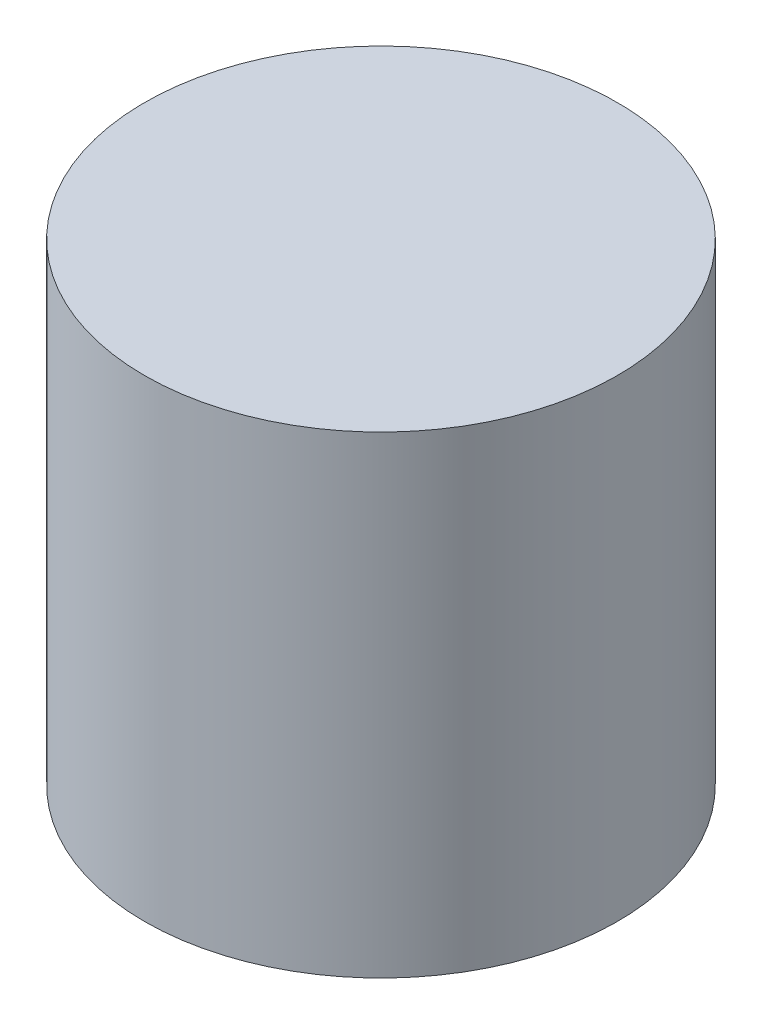
ISO-10303-21;
HEADER;
FILE_DESCRIPTION(('STEP AP214'),'2;1');
FILE_NAME('part.step','',(''),(''),'','','');
FILE_SCHEMA(('AUTOMOTIVE_DESIGN { 1 0 10303 214 1 1 1 1 }'));
ENDSEC;
DATA;
#1=APPLICATION_CONTEXT('core data for automotive mechanical design processes');
#2=APPLICATION_PROTOCOL_DEFINITION('international standard','automotive_design',2000,#1);
#3=PRODUCT_CONTEXT('',#1,'mechanical');
#4=PRODUCT('Part','Part','',(#3));
#5=PRODUCT_RELATED_PRODUCT_CATEGORY('part','',(#4));
#6=PRODUCT_DEFINITION_FORMATION('','',#4);
#7=PRODUCT_DEFINITION_CONTEXT('part definition',#1,'design');
#8=PRODUCT_DEFINITION('design','',#6,#7);
#9=PRODUCT_DEFINITION_SHAPE('','',#8);
#10=(LENGTH_UNIT() NAMED_UNIT(*) SI_UNIT(.MILLI.,.METRE.));
#11=(NAMED_UNIT(*) PLANE_ANGLE_UNIT() SI_UNIT($,.RADIAN.));
#12=(NAMED_UNIT(*) SI_UNIT($,.STERADIAN.) SOLID_ANGLE_UNIT());
#13=UNCERTAINTY_MEASURE_WITH_UNIT(LENGTH_MEASURE(1.E-05),#10,'distance_accuracy_value','');
#14=(GEOMETRIC_REPRESENTATION_CONTEXT(3) GLOBAL_UNCERTAINTY_ASSIGNED_CONTEXT((#13)) GLOBAL_UNIT_ASSIGNED_CONTEXT((#10,
#11,#12)) REPRESENTATION_CONTEXT('',''));
#15=CARTESIAN_POINT('',(0.,0.,0.));
#16=DIRECTION('',(0.,0.,1.));
#17=DIRECTION('',(1.,0.,0.));
#18=AXIS2_PLACEMENT_3D('',#15,#16,#17);
#19=CARTESIAN_POINT('',(0.,0.,0.));
#20=DIRECTION('',(0.,1.,0.));
#21=DIRECTION('',(0.,0.,1.));
#22=AXIS2_PLACEMENT_3D('',#19,#20,#21);
#23=PLANE('',#22);
#24=CARTESIAN_POINT('',(-1.984375,0.,0.));
#25=DIRECTION('',(0.,-1.,0.));
#26=DIRECTION('',(0.,0.,-1.));
#27=AXIS2_PLACEMENT_3D('',#24,#25,#26);
#28=CIRCLE('',#27,0.396875);
#29=CARTESIAN_POINT('',(-1.984375,0.,-0.396875));
#30=VERTEX_POINT('',#29);
#31=EDGE_CURVE('E53',#30,#30,#28,.T.);
#32=ORIENTED_EDGE('',*,*,#31,.F.);
#33=EDGE_LOOP('',(#32));
#34=FACE_BOUND('',#33,.T.);
#35=CARTESIAN_POINT('',(0.,0.,0.));
#36=DIRECTION('',(0.,1.,0.));
#37=DIRECTION('',(0.,0.,1.));
#38=AXIS2_PLACEMENT_3D('',#35,#36,#37);
#39=CIRCLE('',#38,3.175);
#40=CARTESIAN_POINT('',(0.,0.,3.175));
#41=VERTEX_POINT('',#40);
#42=EDGE_CURVE('E41',#41,#41,#39,.T.);
#43=ORIENTED_EDGE('',*,*,#42,.F.);
#44=EDGE_LOOP('',(#43));
#45=FACE_BOUND('',#44,.T.);
#46=CARTESIAN_POINT('',(1.984375,0.,0.));
#47=DIRECTION('',(0.,-1.,0.));
#48=DIRECTION('',(0.,0.,-1.));
#49=AXIS2_PLACEMENT_3D('',#46,#47,#48);
#50=CIRCLE('',#49,0.396875000000001);
#51=CARTESIAN_POINT('',(1.984375,0.,-0.396875000000001));
#52=VERTEX_POINT('',#51);
#53=EDGE_CURVE('E56',#52,#52,#50,.F.);
#54=ORIENTED_EDGE('',*,*,#53,.T.);
#55=EDGE_LOOP('',(#54));
#56=FACE_BOUND('',#55,.T.);
#57=ADVANCED_FACE('F37',(#34,#45,#56),#23,.F.);
#58=CARTESIAN_POINT('',(0.,6.35,0.));
#59=DIRECTION('',(0.,-1.,0.));
#60=DIRECTION('',(0.,0.,-1.));
#61=AXIS2_PLACEMENT_3D('',#58,#59,#60);
#62=CYLINDRICAL_SURFACE('',#61,3.175);
#63=CARTESIAN_POINT('',(0.,6.35,0.));
#64=DIRECTION('',(0.,1.,0.));
#65=DIRECTION('',(0.,0.,1.));
#66=AXIS2_PLACEMENT_3D('',#63,#64,#65);
#67=CIRCLE('',#66,3.175);
#68=CARTESIAN_POINT('',(0.,6.35,3.175));
#69=VERTEX_POINT('',#68);
#70=EDGE_CURVE('E10',#69,#69,#67,.T.);
#71=ORIENTED_EDGE('',*,*,#70,.F.);
#72=EDGE_LOOP('',(#71));
#73=FACE_BOUND('',#72,.T.);
#74=ORIENTED_EDGE('',*,*,#42,.T.);
#75=EDGE_LOOP('',(#74));
#76=FACE_BOUND('',#75,.T.);
#77=ADVANCED_FACE('F39',(#73,#76),#62,.T.);
#78=CARTESIAN_POINT('',(0.,6.35,0.));
#79=DIRECTION('',(0.,1.,0.));
#80=DIRECTION('',(0.,0.,1.));
#81=AXIS2_PLACEMENT_3D('',#78,#79,#80);
#82=PLANE('',#81);
#83=ORIENTED_EDGE('',*,*,#70,.T.);
#84=EDGE_LOOP('',(#83));
#85=FACE_BOUND('',#84,.T.);
#86=ADVANCED_FACE('F80',(#85),#82,.T.);
#87=CARTESIAN_POINT('',(-1.984375,2.11666666666667,0.));
#88=DIRECTION('',(0.,-1.,0.));
#89=DIRECTION('',(0.,0.,-1.));
#90=AXIS2_PLACEMENT_3D('',#87,#88,#89);
#91=CYLINDRICAL_SURFACE('',#90,0.396875);
#92=CARTESIAN_POINT('',(-1.984375,2.11666666666667,0.));
#93=DIRECTION('',(0.,-1.,0.));
#94=DIRECTION('',(0.,0.,-1.));
#95=AXIS2_PLACEMENT_3D('',#92,#93,#94);
#96=CIRCLE('',#95,0.396875);
#97=CARTESIAN_POINT('',(-1.984375,2.11666666666667,-0.396875));
#98=VERTEX_POINT('',#97);
#99=EDGE_CURVE('E50',#98,#98,#96,.T.);
#100=ORIENTED_EDGE('',*,*,#99,.F.);
#101=EDGE_LOOP('',(#100));
#102=FACE_BOUND('',#101,.T.);
#103=ORIENTED_EDGE('',*,*,#31,.T.);
#104=EDGE_LOOP('',(#103));
#105=FACE_BOUND('',#104,.T.);
#106=ADVANCED_FACE('F86',(#102,#105),#91,.F.);
#107=CARTESIAN_POINT('',(-1.984375,2.11666666666667,0.));
#108=DIRECTION('',(0.,-1.,0.));
#109=DIRECTION('',(0.,0.,-1.));
#110=AXIS2_PLACEMENT_3D('',#107,#108,#109);
#111=PLANE('',#110);
#112=ORIENTED_EDGE('',*,*,#99,.T.);
#113=EDGE_LOOP('',(#112));
#114=FACE_BOUND('',#113,.T.);
#115=ADVANCED_FACE('F71',(#114),#111,.T.);
#116=CARTESIAN_POINT('',(1.984375,2.11666666666667,0.));
#117=DIRECTION('',(0.,-1.,0.));
#118=DIRECTION('',(0.,0.,-1.));
#119=AXIS2_PLACEMENT_3D('',#116,#117,#118);
#120=CYLINDRICAL_SURFACE('',#119,0.396875000000001);
#121=CARTESIAN_POINT('',(1.984375,2.11666666666667,0.));
#122=DIRECTION('',(0.,-1.,0.));
#123=DIRECTION('',(0.,0.,-1.));
#124=AXIS2_PLACEMENT_3D('',#121,#122,#123);
#125=CIRCLE('',#124,0.396875000000001);
#126=CARTESIAN_POINT('',(1.984375,2.11666666666667,-0.396875000000001));
#127=VERTEX_POINT('',#126);
#128=EDGE_CURVE('E48',#127,#127,#125,.F.);
#129=ORIENTED_EDGE('',*,*,#128,.T.);
#130=EDGE_LOOP('',(#129));
#131=FACE_BOUND('',#130,.T.);
#132=ORIENTED_EDGE('',*,*,#53,.F.);
#133=EDGE_LOOP('',(#132));
#134=FACE_BOUND('',#133,.T.);
#135=ADVANCED_FACE('F62',(#131,#134),#120,.F.);
#136=CARTESIAN_POINT('',(0.,2.11666666666667,0.));
#137=DIRECTION('',(0.,-1.,0.));
#138=DIRECTION('',(0.,0.,-1.));
#139=AXIS2_PLACEMENT_3D('',#136,#137,#138);
#140=PLANE('',#139);
#141=ORIENTED_EDGE('',*,*,#128,.F.);
#142=EDGE_LOOP('',(#141));
#143=FACE_BOUND('',#142,.T.);
#144=ADVANCED_FACE('F65',(#143),#140,.T.);
#145=CLOSED_SHELL('',(#57,#77,#86,#106,#115,#135,#144));
#146=MANIFOLD_SOLID_BREP('B2',#145);
#147=ADVANCED_BREP_SHAPE_REPRESENTATION('',(#18,#146),#14);
#148=SHAPE_DEFINITION_REPRESENTATION(#9,#147);
ENDSEC;
END-ISO-10303-21;
